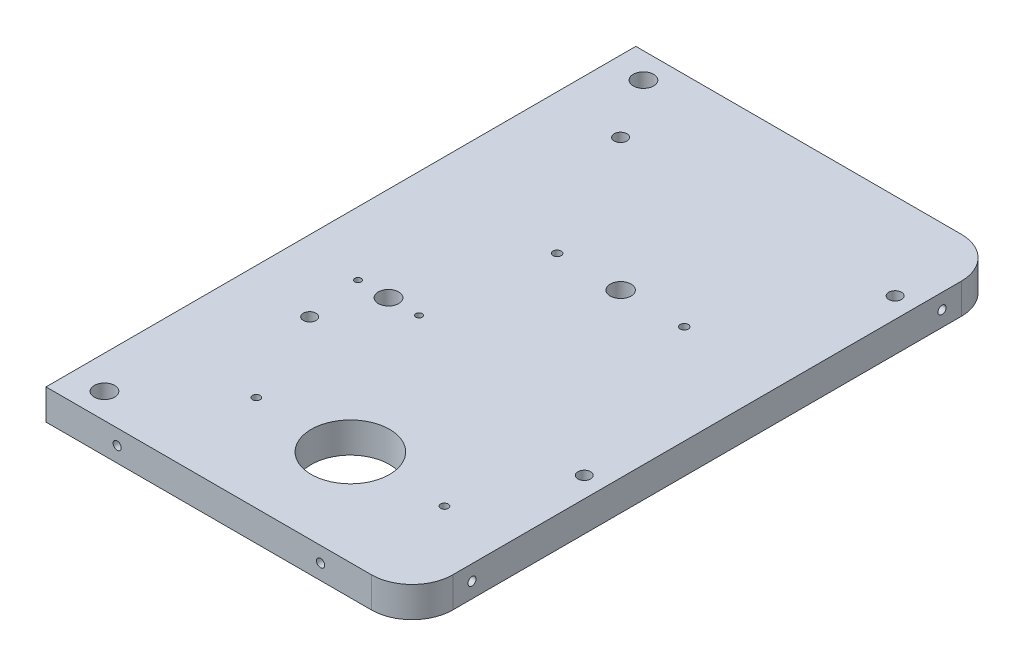
ISO-10303-21;
HEADER;
FILE_DESCRIPTION(('STEP AP214'),'2;1');
FILE_NAME('part.step','',(''),(''),'','','');
FILE_SCHEMA(('AUTOMOTIVE_DESIGN { 1 0 10303 214 1 1 1 1 }'));
ENDSEC;
DATA;
#1=APPLICATION_CONTEXT('core data for automotive mechanical design processes');
#2=APPLICATION_PROTOCOL_DEFINITION('international standard','automotive_design',2000,#1);
#3=PRODUCT_CONTEXT('',#1,'mechanical');
#4=PRODUCT('Part','Part','',(#3));
#5=PRODUCT_RELATED_PRODUCT_CATEGORY('part','',(#4));
#6=PRODUCT_DEFINITION_FORMATION('','',#4);
#7=PRODUCT_DEFINITION_CONTEXT('part definition',#1,'design');
#8=PRODUCT_DEFINITION('design','',#6,#7);
#9=PRODUCT_DEFINITION_SHAPE('','',#8);
#10=(LENGTH_UNIT() NAMED_UNIT(*) SI_UNIT(.MILLI.,.METRE.));
#11=(NAMED_UNIT(*) PLANE_ANGLE_UNIT() SI_UNIT($,.RADIAN.));
#12=(NAMED_UNIT(*) SI_UNIT($,.STERADIAN.) SOLID_ANGLE_UNIT());
#13=UNCERTAINTY_MEASURE_WITH_UNIT(LENGTH_MEASURE(1.E-05),#10,'distance_accuracy_value','');
#14=(GEOMETRIC_REPRESENTATION_CONTEXT(3) GLOBAL_UNCERTAINTY_ASSIGNED_CONTEXT((#13)) GLOBAL_UNIT_ASSIGNED_CONTEXT((#10,
#11,#12)) REPRESENTATION_CONTEXT('',''));
#15=CARTESIAN_POINT('',(0.,0.,0.));
#16=DIRECTION('',(0.,0.,1.));
#17=DIRECTION('',(1.,0.,0.));
#18=AXIS2_PLACEMENT_3D('',#15,#16,#17);
#19=CARTESIAN_POINT('',(0.,0.,0.));
#20=DIRECTION('',(0.,1.,0.));
#21=DIRECTION('',(0.,0.,1.));
#22=AXIS2_PLACEMENT_3D('',#19,#20,#21);
#23=PLANE('',#22);
#24=CARTESIAN_POINT('',(-0.981223813791759,0.,-18.0000330176937));
#25=DIRECTION('',(0.,-1.,0.));
#26=DIRECTION('',(0.,0.,-1.));
#27=AXIS2_PLACEMENT_3D('',#24,#25,#26);
#28=CIRCLE('',#27,2.05);
#29=CARTESIAN_POINT('',(-0.981223813791759,0.,-20.0500330176937));
#30=VERTEX_POINT('',#29);
#31=EDGE_CURVE('E192',#30,#30,#28,.T.);
#32=ORIENTED_EDGE('',*,*,#31,.F.);
#33=EDGE_LOOP('',(#32));
#34=FACE_BOUND('',#33,.T.);
#35=CARTESIAN_POINT('',(-0.981223813791759,0.,-18.0000330176937));
#36=DIRECTION('',(0.,-1.,0.));
#37=DIRECTION('',(0.,0.,-1.));
#38=AXIS2_PLACEMENT_3D('',#35,#36,#37);
#39=CIRCLE('',#38,2.55);
#40=CARTESIAN_POINT('',(-0.981223813791759,0.,-20.5500330176937));
#41=VERTEX_POINT('',#40);
#42=EDGE_CURVE('E195',#41,#41,#39,.T.);
#43=ORIENTED_EDGE('',*,*,#42,.T.);
#44=EDGE_LOOP('',(#43));
#45=FACE_BOUND('',#44,.T.);
#46=ADVANCED_FACE('F41',(#34,#45),#23,.F.);
#47=CARTESIAN_POINT('',(31.,3.,0.));
#48=DIRECTION('',(-1.,0.,0.));
#49=DIRECTION('',(0.,0.,1.));
#50=AXIS2_PLACEMENT_3D('',#47,#48,#49);
#51=PLANE('',#50);
#52=DIRECTION('',(0.,-1.,0.));
#53=VECTOR('',#52,1.);
#54=CARTESIAN_POINT('',(31.,7.,47.));
#55=LINE('',#54,#53);
#56=CARTESIAN_POINT('',(31.,3.,47.));
#57=VERTEX_POINT('',#56);
#58=CARTESIAN_POINT('',(31.,-3.,46.9999999999999));
#59=VERTEX_POINT('',#58);
#60=EDGE_CURVE('E134',#57,#59,#55,.T.);
#61=ORIENTED_EDGE('',*,*,#60,.T.);
#62=DIRECTION('',(0.,0.,1.));
#63=VECTOR('',#62,1.);
#64=CARTESIAN_POINT('',(31.,-3.,46.9999999999999));
#65=LINE('',#64,#63);
#66=CARTESIAN_POINT('',(31.,-3.,-53.));
#67=VERTEX_POINT('',#66);
#68=EDGE_CURVE('E128',#67,#59,#65,.T.);
#69=ORIENTED_EDGE('',*,*,#68,.F.);
#70=DIRECTION('',(0.,-1.,0.));
#71=VECTOR('',#70,1.);
#72=CARTESIAN_POINT('',(31.,7.,-53.));
#73=LINE('',#72,#71);
#74=CARTESIAN_POINT('',(31.,3.,-53.));
#75=VERTEX_POINT('',#74);
#76=EDGE_CURVE('E135',#75,#67,#73,.T.);
#77=ORIENTED_EDGE('',*,*,#76,.F.);
#78=DIRECTION('',(0.,0.,-1.));
#79=VECTOR('',#78,1.);
#80=CARTESIAN_POINT('',(31.,3.,0.));
#81=LINE('',#80,#79);
#82=EDGE_CURVE('E155',#57,#75,#81,.T.);
#83=ORIENTED_EDGE('',*,*,#82,.F.);
#84=EDGE_LOOP('',(#61,#69,#77,#83));
#85=FACE_BOUND('',#84,.T.);
#86=CARTESIAN_POINT('',(31.,0.,43.220009523448));
#87=DIRECTION('',(1.,0.,0.));
#88=DIRECTION('',(0.,0.,-1.));
#89=AXIS2_PLACEMENT_3D('',#86,#87,#88);
#90=CIRCLE('',#89,0.800000000000003);
#91=CARTESIAN_POINT('',(31.,0.,42.420009523448));
#92=VERTEX_POINT('',#91);
#93=EDGE_CURVE('E372',#92,#92,#90,.T.);
#94=ORIENTED_EDGE('',*,*,#93,.F.);
#95=EDGE_LOOP('',(#94));
#96=FACE_BOUND('',#95,.T.);
#97=CARTESIAN_POINT('',(31.,0.,-49.2200090857758));
#98=DIRECTION('',(1.,0.,0.));
#99=DIRECTION('',(0.,0.,-1.));
#100=AXIS2_PLACEMENT_3D('',#97,#98,#99);
#101=CIRCLE('',#100,0.800000000000003);
#102=CARTESIAN_POINT('',(31.,0.,-50.0200090857758));
#103=VERTEX_POINT('',#102);
#104=EDGE_CURVE('E381',#103,#103,#101,.T.);
#105=ORIENTED_EDGE('',*,*,#104,.F.);
#106=EDGE_LOOP('',(#105));
#107=FACE_BOUND('',#106,.T.);
#108=ADVANCED_FACE('F166',(#85,#96,#107),#51,.F.);
#109=CARTESIAN_POINT('',(31.,3.,-61.));
#110=DIRECTION('',(0.,0.,1.));
#111=DIRECTION('',(1.,0.,0.));
#112=AXIS2_PLACEMENT_3D('',#109,#110,#111);
#113=PLANE('',#112);
#114=DIRECTION('',(0.,-1.,0.));
#115=VECTOR('',#114,1.);
#116=CARTESIAN_POINT('',(23.,7.,-61.));
#117=LINE('',#116,#115);
#118=CARTESIAN_POINT('',(23.,-3.,-61.));
#119=VERTEX_POINT('',#118);
#120=CARTESIAN_POINT('',(23.,3.,-61.));
#121=VERTEX_POINT('',#120);
#122=EDGE_CURVE('E11',#119,#121,#117,.F.);
#123=ORIENTED_EDGE('',*,*,#122,.F.);
#124=DIRECTION('',(1.,0.,0.));
#125=VECTOR('',#124,1.);
#126=CARTESIAN_POINT('',(-41.,-3.,-61.));
#127=LINE('',#126,#125);
#128=CARTESIAN_POINT('',(-41.,-3.,-61.));
#129=VERTEX_POINT('',#128);
#130=EDGE_CURVE('E106',#129,#119,#127,.T.);
#131=ORIENTED_EDGE('',*,*,#130,.F.);
#132=DIRECTION('',(0.,-1.,0.));
#133=VECTOR('',#132,1.);
#134=CARTESIAN_POINT('',(-41.,3.,-61.));
#135=LINE('',#134,#133);
#136=CARTESIAN_POINT('',(-41.,3.,-61.));
#137=VERTEX_POINT('',#136);
#138=EDGE_CURVE('E94',#137,#129,#135,.T.);
#139=ORIENTED_EDGE('',*,*,#138,.F.);
#140=DIRECTION('',(-1.,0.,0.));
#141=VECTOR('',#140,1.);
#142=CARTESIAN_POINT('',(31.,3.,-61.));
#143=LINE('',#142,#141);
#144=EDGE_CURVE('E63',#121,#137,#143,.T.);
#145=ORIENTED_EDGE('',*,*,#144,.F.);
#146=EDGE_LOOP('',(#123,#131,#139,#145));
#147=FACE_BOUND('',#146,.T.);
#148=CARTESIAN_POINT('',(12.9999999999997,0.,-61.));
#149=DIRECTION('',(0.,0.,-1.));
#150=DIRECTION('',(-1.,0.,0.));
#151=AXIS2_PLACEMENT_3D('',#148,#149,#150);
#152=CIRCLE('',#151,0.800000000000001);
#153=CARTESIAN_POINT('',(12.1999999999997,0.,-61.));
#154=VERTEX_POINT('',#153);
#155=EDGE_CURVE('E267',#154,#154,#152,.T.);
#156=ORIENTED_EDGE('',*,*,#155,.F.);
#157=EDGE_LOOP('',(#156));
#158=FACE_BOUND('',#157,.T.);
#159=CARTESIAN_POINT('',(-27.0000000000002,0.,-61.));
#160=DIRECTION('',(0.,0.,-1.));
#161=DIRECTION('',(-1.,0.,0.));
#162=AXIS2_PLACEMENT_3D('',#159,#160,#161);
#163=CIRCLE('',#162,0.799999999999999);
#164=CARTESIAN_POINT('',(-27.8000000000002,0.,-61.));
#165=VERTEX_POINT('',#164);
#166=EDGE_CURVE('E371',#165,#165,#163,.T.);
#167=ORIENTED_EDGE('',*,*,#166,.F.);
#168=EDGE_LOOP('',(#167));
#169=FACE_BOUND('',#168,.T.);
#170=ADVANCED_FACE('F107',(#147,#158,#169),#113,.F.);
#171=CARTESIAN_POINT('',(0.,3.,0.));
#172=DIRECTION('',(0.,1.,0.));
#173=DIRECTION('',(0.,0.,1.));
#174=AXIS2_PLACEMENT_3D('',#171,#172,#173);
#175=PLANE('',#174);
#176=CARTESIAN_POINT('',(-13.4812238138933,3.,-18.0000330178182));
#177=DIRECTION('',(0.,-1.,0.));
#178=DIRECTION('',(0.,0.,-1.));
#179=AXIS2_PLACEMENT_3D('',#176,#177,#178);
#180=CIRCLE('',#179,0.800000000000001);
#181=CARTESIAN_POINT('',(-13.4812238138933,3.,-18.8000330178182));
#182=VERTEX_POINT('',#181);
#183=EDGE_CURVE('E738',#182,#182,#180,.T.);
#184=ORIENTED_EDGE('',*,*,#183,.T.);
#185=EDGE_LOOP('',(#184));
#186=FACE_BOUND('',#185,.T.);
#187=CARTESIAN_POINT('',(11.5187761861068,3.,-18.0000330178182));
#188=DIRECTION('',(0.,-1.,0.));
#189=DIRECTION('',(0.,0.,-1.));
#190=AXIS2_PLACEMENT_3D('',#187,#188,#189);
#191=CIRCLE('',#190,0.800000000000003);
#192=CARTESIAN_POINT('',(11.5187761861068,3.,-18.8000330178182));
#193=VERTEX_POINT('',#192);
#194=EDGE_CURVE('E742',#193,#193,#191,.T.);
#195=ORIENTED_EDGE('',*,*,#194,.T.);
#196=EDGE_LOOP('',(#195));
#197=FACE_BOUND('',#196,.T.);
#198=CARTESIAN_POINT('',(-0.981223813791759,3.,-18.0000330176937));
#199=DIRECTION('',(0.,-1.,0.));
#200=DIRECTION('',(0.,0.,-1.));
#201=AXIS2_PLACEMENT_3D('',#198,#199,#200);
#202=CIRCLE('',#201,2.05);
#203=CARTESIAN_POINT('',(-0.981223813791759,3.,-20.0500330176937));
#204=VERTEX_POINT('',#203);
#205=EDGE_CURVE('E204',#204,#204,#202,.T.);
#206=ORIENTED_EDGE('',*,*,#205,.T.);
#207=EDGE_LOOP('',(#206));
#208=FACE_BOUND('',#207,.T.);
#209=CARTESIAN_POINT('',(-22.5019779725675,3.,6.1394144977128));
#210=DIRECTION('',(0.,-1.,0.));
#211=DIRECTION('',(0.,0.,-1.));
#212=AXIS2_PLACEMENT_3D('',#209,#210,#211);
#213=CIRCLE('',#212,1.99999999989408);
#214=CARTESIAN_POINT('',(-22.5019779725675,3.,4.13941449781872));
#215=VERTEX_POINT('',#214);
#216=EDGE_CURVE('E201',#215,#215,#213,.T.);
#217=ORIENTED_EDGE('',*,*,#216,.T.);
#218=EDGE_LOOP('',(#217));
#219=FACE_BOUND('',#218,.T.);
#220=CARTESIAN_POINT('',(23.,3.,-53.));
#221=DIRECTION('',(0.,1.,0.));
#222=DIRECTION('',(0.,0.,1.));
#223=AXIS2_PLACEMENT_3D('',#220,#221,#222);
#224=CIRCLE('',#223,8.);
#225=EDGE_CURVE('E139',#121,#75,#224,.F.);
#226=ORIENTED_EDGE('',*,*,#225,.F.);
#227=ORIENTED_EDGE('',*,*,#144,.T.);
#228=DIRECTION('',(0.,0.,-1.));
#229=VECTOR('',#228,1.);
#230=CARTESIAN_POINT('',(-41.,3.,55.));
#231=LINE('',#230,#229);
#232=CARTESIAN_POINT('',(-41.,3.,55.));
#233=VERTEX_POINT('',#232);
#234=EDGE_CURVE('E100',#233,#137,#231,.T.);
#235=ORIENTED_EDGE('',*,*,#234,.F.);
#236=DIRECTION('',(1.,0.,0.));
#237=VECTOR('',#236,1.);
#238=CARTESIAN_POINT('',(-31.,3.,55.));
#239=LINE('',#238,#237);
#240=CARTESIAN_POINT('',(23.,3.,55.));
#241=VERTEX_POINT('',#240);
#242=EDGE_CURVE('E102',#233,#241,#239,.T.);
#243=ORIENTED_EDGE('',*,*,#242,.T.);
#244=CARTESIAN_POINT('',(23.,3.,47.));
#245=DIRECTION('',(0.,1.,0.));
#246=DIRECTION('',(0.,0.,1.));
#247=AXIS2_PLACEMENT_3D('',#244,#245,#246);
#248=CIRCLE('',#247,8.);
#249=EDGE_CURVE('E55',#57,#241,#248,.F.);
#250=ORIENTED_EDGE('',*,*,#249,.F.);
#251=ORIENTED_EDGE('',*,*,#82,.T.);
#252=EDGE_LOOP('',(#226,#227,#235,#243,#250,#251));
#253=FACE_BOUND('',#252,.T.);
#254=CARTESIAN_POINT('',(-34.5,3.,50.));
#255=DIRECTION('',(0.,1.,0.));
#256=DIRECTION('',(0.,0.,1.));
#257=AXIS2_PLACEMENT_3D('',#254,#255,#256);
#258=CIRCLE('',#257,2.);
#259=CARTESIAN_POINT('',(-34.5,3.,52.));
#260=VERTEX_POINT('',#259);
#261=EDGE_CURVE('E144',#260,#260,#258,.T.);
#262=ORIENTED_EDGE('',*,*,#261,.F.);
#263=EDGE_LOOP('',(#262));
#264=FACE_BOUND('',#263,.T.);
#265=CARTESIAN_POINT('',(-34.5,3.,-56.));
#266=DIRECTION('',(0.,1.,0.));
#267=DIRECTION('',(0.,0.,1.));
#268=AXIS2_PLACEMENT_3D('',#265,#266,#267);
#269=CIRCLE('',#268,2.);
#270=CARTESIAN_POINT('',(-34.5,3.,-54.));
#271=VERTEX_POINT('',#270);
#272=EDGE_CURVE('E141',#271,#271,#269,.T.);
#273=ORIENTED_EDGE('',*,*,#272,.F.);
#274=EDGE_LOOP('',(#273));
#275=FACE_BOUND('',#274,.T.);
#276=CARTESIAN_POINT('',(0.,3.,36.1397530310026));
#277=DIRECTION('',(0.,-1.,0.));
#278=DIRECTION('',(0.,0.,-1.));
#279=AXIS2_PLACEMENT_3D('',#276,#277,#278);
#280=CIRCLE('',#279,7.7);
#281=CARTESIAN_POINT('',(0.,3.,28.4397530310026));
#282=VERTEX_POINT('',#281);
#283=EDGE_CURVE('E151',#282,#282,#280,.T.);
#284=ORIENTED_EDGE('',*,*,#283,.T.);
#285=EDGE_LOOP('',(#284));
#286=FACE_BOUND('',#285,.T.);
#287=CARTESIAN_POINT('',(27.,3.,17.1397530310026));
#288=DIRECTION('',(0.,-1.,0.));
#289=DIRECTION('',(0.,0.,-1.));
#290=AXIS2_PLACEMENT_3D('',#287,#288,#289);
#291=CIRCLE('',#290,1.25);
#292=CARTESIAN_POINT('',(27.,3.,15.8897530310026));
#293=VERTEX_POINT('',#292);
#294=EDGE_CURVE('E295',#293,#293,#291,.T.);
#295=ORIENTED_EDGE('',*,*,#294,.T.);
#296=EDGE_LOOP('',(#295));
#297=FACE_BOUND('',#296,.T.);
#298=CARTESIAN_POINT('',(27.,3.,-44.));
#299=DIRECTION('',(0.,-1.,0.));
#300=DIRECTION('',(0.,0.,-1.));
#301=AXIS2_PLACEMENT_3D('',#298,#299,#300);
#302=CIRCLE('',#301,1.25);
#303=CARTESIAN_POINT('',(27.,3.,-45.25));
#304=VERTEX_POINT('',#303);
#305=EDGE_CURVE('E291',#304,#304,#302,.T.);
#306=ORIENTED_EDGE('',*,*,#305,.T.);
#307=EDGE_LOOP('',(#306));
#308=FACE_BOUND('',#307,.T.);
#309=CARTESIAN_POINT('',(-27.,3.,17.1397530310026));
#310=DIRECTION('',(0.,-1.,0.));
#311=DIRECTION('',(0.,0.,-1.));
#312=AXIS2_PLACEMENT_3D('',#309,#310,#311);
#313=CIRCLE('',#312,1.25);
#314=CARTESIAN_POINT('',(-27.,3.,15.8897530310026));
#315=VERTEX_POINT('',#314);
#316=EDGE_CURVE('E287',#315,#315,#313,.T.);
#317=ORIENTED_EDGE('',*,*,#316,.T.);
#318=EDGE_LOOP('',(#317));
#319=FACE_BOUND('',#318,.T.);
#320=CARTESIAN_POINT('',(18.5,3.,36.1397772027098));
#321=DIRECTION('',(0.,-1.,0.));
#322=DIRECTION('',(0.,0.,-1.));
#323=AXIS2_PLACEMENT_3D('',#320,#321,#322);
#324=CIRCLE('',#323,0.750000000000002);
#325=CARTESIAN_POINT('',(18.5,3.,35.3897772027098));
#326=VERTEX_POINT('',#325);
#327=EDGE_CURVE('E283',#326,#326,#324,.T.);
#328=ORIENTED_EDGE('',*,*,#327,.T.);
#329=EDGE_LOOP('',(#328));
#330=FACE_BOUND('',#329,.T.);
#331=CARTESIAN_POINT('',(-27.,3.,-44.));
#332=DIRECTION('',(0.,-1.,0.));
#333=DIRECTION('',(0.,0.,1.));
#334=AXIS2_PLACEMENT_3D('',#331,#332,#333);
#335=CIRCLE('',#334,1.25000000000003);
#336=CARTESIAN_POINT('',(-27.,3.,-42.75));
#337=VERTEX_POINT('',#336);
#338=EDGE_CURVE('E279',#337,#337,#335,.T.);
#339=ORIENTED_EDGE('',*,*,#338,.T.);
#340=EDGE_LOOP('',(#339));
#341=FACE_BOUND('',#340,.T.);
#342=CARTESIAN_POINT('',(-18.5,3.,36.1397772027098));
#343=DIRECTION('',(0.,-1.,0.));
#344=DIRECTION('',(0.,0.,1.));
#345=AXIS2_PLACEMENT_3D('',#342,#343,#344);
#346=CIRCLE('',#345,0.750000000000002);
#347=CARTESIAN_POINT('',(-18.5,3.,36.8897772027098));
#348=VERTEX_POINT('',#347);
#349=EDGE_CURVE('E275',#348,#348,#346,.T.);
#350=ORIENTED_EDGE('',*,*,#349,.T.);
#351=EDGE_LOOP('',(#350));
#352=FACE_BOUND('',#351,.T.);
#353=CARTESIAN_POINT('',(-16.5015460168153,3.,6.1397530310026));
#354=DIRECTION('',(0.,-1.,0.));
#355=DIRECTION('',(0.,0.,-1.));
#356=AXIS2_PLACEMENT_3D('',#353,#354,#355);
#357=CIRCLE('',#356,0.625000000000002);
#358=CARTESIAN_POINT('',(-16.5015460168153,3.,5.5147530310026));
#359=VERTEX_POINT('',#358);
#360=EDGE_CURVE('E271',#359,#359,#357,.T.);
#361=ORIENTED_EDGE('',*,*,#360,.T.);
#362=EDGE_LOOP('',(#361));
#363=FACE_BOUND('',#362,.T.);
#364=CARTESIAN_POINT('',(-28.5024099283197,3.,6.1397530310026));
#365=DIRECTION('',(0.,-1.,0.));
#366=DIRECTION('',(0.,0.,1.));
#367=AXIS2_PLACEMENT_3D('',#364,#365,#366);
#368=CIRCLE('',#367,0.625000000000002);
#369=CARTESIAN_POINT('',(-28.5024099283197,3.,6.76475303100261));
#370=VERTEX_POINT('',#369);
#371=EDGE_CURVE('E261',#370,#370,#368,.T.);
#372=ORIENTED_EDGE('',*,*,#371,.T.);
#373=EDGE_LOOP('',(#372));
#374=FACE_BOUND('',#373,.T.);
#375=ADVANCED_FACE('F161',(#186,#197,#208,#219,#253,#264,#275,#286,#297,#308,#319,#330,#341,
#352,#363,#374),#175,.T.);
#376=CARTESIAN_POINT('',(0.,3.,36.1397530310026));
#377=DIRECTION('',(0.,-1.,0.));
#378=DIRECTION('',(0.,0.,-1.));
#379=AXIS2_PLACEMENT_3D('',#376,#377,#378);
#380=CYLINDRICAL_SURFACE('',#379,7.7);
#381=ORIENTED_EDGE('',*,*,#283,.F.);
#382=EDGE_LOOP('',(#381));
#383=FACE_BOUND('',#382,.T.);
#384=CARTESIAN_POINT('',(0.,-3.,36.1397530310026));
#385=DIRECTION('',(0.,-1.,0.));
#386=DIRECTION('',(0.,0.,-1.));
#387=AXIS2_PLACEMENT_3D('',#384,#385,#386);
#388=CIRCLE('',#387,7.7);
#389=CARTESIAN_POINT('',(0.,-3.,28.4397530310026));
#390=VERTEX_POINT('',#389);
#391=EDGE_CURVE('E120',#390,#390,#388,.T.);
#392=ORIENTED_EDGE('',*,*,#391,.T.);
#393=EDGE_LOOP('',(#392));
#394=FACE_BOUND('',#393,.T.);
#395=ADVANCED_FACE('F435',(#383,#394),#380,.F.);
#396=CARTESIAN_POINT('',(-31.,3.,55.));
#397=DIRECTION('',(0.,0.,-1.));
#398=DIRECTION('',(-1.,0.,0.));
#399=AXIS2_PLACEMENT_3D('',#396,#397,#398);
#400=PLANE('',#399);
#401=DIRECTION('',(0.,-1.,0.));
#402=VECTOR('',#401,1.);
#403=CARTESIAN_POINT('',(-41.,3.,55.));
#404=LINE('',#403,#402);
#405=CARTESIAN_POINT('',(-41.,-3.,55.));
#406=VERTEX_POINT('',#405);
#407=EDGE_CURVE('E103',#233,#406,#404,.T.);
#408=ORIENTED_EDGE('',*,*,#407,.T.);
#409=DIRECTION('',(-1.,0.,0.));
#410=VECTOR('',#409,1.);
#411=CARTESIAN_POINT('',(-41.,-3.,55.));
#412=LINE('',#411,#410);
#413=CARTESIAN_POINT('',(22.9999999999999,-3.,55.));
#414=VERTEX_POINT('',#413);
#415=EDGE_CURVE('E119',#414,#406,#412,.T.);
#416=ORIENTED_EDGE('',*,*,#415,.F.);
#417=DIRECTION('',(0.,-1.,0.));
#418=VECTOR('',#417,1.);
#419=CARTESIAN_POINT('',(23.,7.,55.));
#420=LINE('',#419,#418);
#421=EDGE_CURVE('E48',#414,#241,#420,.F.);
#422=ORIENTED_EDGE('',*,*,#421,.T.);
#423=ORIENTED_EDGE('',*,*,#242,.F.);
#424=EDGE_LOOP('',(#408,#416,#422,#423));
#425=FACE_BOUND('',#424,.T.);
#426=CARTESIAN_POINT('',(-27.0000000000002,0.,55.));
#427=DIRECTION('',(0.,0.,1.));
#428=DIRECTION('',(1.,0.,0.));
#429=AXIS2_PLACEMENT_3D('',#426,#427,#428);
#430=CIRCLE('',#429,0.799999999999999);
#431=CARTESIAN_POINT('',(-26.2000000000002,0.,55.));
#432=VERTEX_POINT('',#431);
#433=EDGE_CURVE('E755',#432,#432,#430,.T.);
#434=ORIENTED_EDGE('',*,*,#433,.F.);
#435=EDGE_LOOP('',(#434));
#436=FACE_BOUND('',#435,.T.);
#437=CARTESIAN_POINT('',(12.9999999999997,0.,55.));
#438=DIRECTION('',(0.,0.,1.));
#439=DIRECTION('',(1.,0.,0.));
#440=AXIS2_PLACEMENT_3D('',#437,#438,#439);
#441=CIRCLE('',#440,0.800000000000001);
#442=CARTESIAN_POINT('',(13.7999999999997,0.,55.));
#443=VERTEX_POINT('',#442);
#444=EDGE_CURVE('E744',#443,#443,#441,.T.);
#445=ORIENTED_EDGE('',*,*,#444,.F.);
#446=EDGE_LOOP('',(#445));
#447=FACE_BOUND('',#446,.T.);
#448=ADVANCED_FACE('F158',(#425,#436,#447),#400,.F.);
#449=CARTESIAN_POINT('',(-41.,3.,55.));
#450=DIRECTION('',(-1.,0.,0.));
#451=DIRECTION('',(0.,0.,1.));
#452=AXIS2_PLACEMENT_3D('',#449,#450,#451);
#453=PLANE('',#452);
#454=ORIENTED_EDGE('',*,*,#138,.T.);
#455=DIRECTION('',(0.,0.,-1.));
#456=VECTOR('',#455,1.);
#457=CARTESIAN_POINT('',(-41.,-3.,55.));
#458=LINE('',#457,#456);
#459=EDGE_CURVE('E99',#406,#129,#458,.T.);
#460=ORIENTED_EDGE('',*,*,#459,.F.);
#461=ORIENTED_EDGE('',*,*,#407,.F.);
#462=ORIENTED_EDGE('',*,*,#234,.T.);
#463=EDGE_LOOP('',(#454,#460,#461,#462));
#464=FACE_BOUND('',#463,.T.);
#465=ADVANCED_FACE('F96',(#464),#453,.T.);
#466=CARTESIAN_POINT('',(-34.5,10.,-56.));
#467=DIRECTION('',(0.,-1.,0.));
#468=DIRECTION('',(0.,0.,-1.));
#469=AXIS2_PLACEMENT_3D('',#466,#467,#468);
#470=CYLINDRICAL_SURFACE('',#469,2.);
#471=ORIENTED_EDGE('',*,*,#272,.T.);
#472=EDGE_LOOP('',(#471));
#473=FACE_BOUND('',#472,.T.);
#474=CARTESIAN_POINT('',(-34.5,-3.,-56.));
#475=DIRECTION('',(0.,-1.,0.));
#476=DIRECTION('',(0.,0.,-1.));
#477=AXIS2_PLACEMENT_3D('',#474,#475,#476);
#478=CIRCLE('',#477,2.);
#479=CARTESIAN_POINT('',(-34.5,-3.,-58.));
#480=VERTEX_POINT('',#479);
#481=EDGE_CURVE('E123',#480,#480,#478,.T.);
#482=ORIENTED_EDGE('',*,*,#481,.T.);
#483=EDGE_LOOP('',(#482));
#484=FACE_BOUND('',#483,.T.);
#485=ADVANCED_FACE('F180',(#473,#484),#470,.F.);
#486=CARTESIAN_POINT('',(-34.5,10.,50.));
#487=DIRECTION('',(0.,-1.,0.));
#488=DIRECTION('',(0.,0.,-1.));
#489=AXIS2_PLACEMENT_3D('',#486,#487,#488);
#490=CYLINDRICAL_SURFACE('',#489,2.);
#491=ORIENTED_EDGE('',*,*,#261,.T.);
#492=EDGE_LOOP('',(#491));
#493=FACE_BOUND('',#492,.T.);
#494=CARTESIAN_POINT('',(-34.5,-3.,50.));
#495=DIRECTION('',(0.,-1.,0.));
#496=DIRECTION('',(0.,0.,-1.));
#497=AXIS2_PLACEMENT_3D('',#494,#495,#496);
#498=CIRCLE('',#497,2.);
#499=CARTESIAN_POINT('',(-34.5,-3.,48.));
#500=VERTEX_POINT('',#499);
#501=EDGE_CURVE('E215',#500,#500,#498,.T.);
#502=ORIENTED_EDGE('',*,*,#501,.T.);
#503=EDGE_LOOP('',(#502));
#504=FACE_BOUND('',#503,.T.);
#505=ADVANCED_FACE('F173',(#493,#504),#490,.F.);
#506=CARTESIAN_POINT('',(23.,7.,47.));
#507=DIRECTION('',(0.,-1.,0.));
#508=DIRECTION('',(0.,0.,-1.));
#509=AXIS2_PLACEMENT_3D('',#506,#507,#508);
#510=CYLINDRICAL_SURFACE('',#509,8.);
#511=ORIENTED_EDGE('',*,*,#249,.T.);
#512=ORIENTED_EDGE('',*,*,#421,.F.);
#513=CARTESIAN_POINT('',(23.,-3.,47.));
#514=DIRECTION('',(0.,-1.,0.));
#515=DIRECTION('',(0.,0.,1.));
#516=AXIS2_PLACEMENT_3D('',#513,#514,#515);
#517=CIRCLE('',#516,8.);
#518=EDGE_CURVE('E131',#59,#414,#517,.T.);
#519=ORIENTED_EDGE('',*,*,#518,.F.);
#520=ORIENTED_EDGE('',*,*,#60,.F.);
#521=EDGE_LOOP('',(#511,#512,#519,#520));
#522=FACE_BOUND('',#521,.T.);
#523=ADVANCED_FACE('F171',(#522),#510,.T.);
#524=CARTESIAN_POINT('',(23.,7.,-53.));
#525=DIRECTION('',(0.,-1.,0.));
#526=DIRECTION('',(0.,0.,-1.));
#527=AXIS2_PLACEMENT_3D('',#524,#525,#526);
#528=CYLINDRICAL_SURFACE('',#527,8.);
#529=ORIENTED_EDGE('',*,*,#225,.T.);
#530=ORIENTED_EDGE('',*,*,#76,.T.);
#531=CARTESIAN_POINT('',(23.,-3.,-53.));
#532=DIRECTION('',(0.,-1.,0.));
#533=DIRECTION('',(0.,0.,-1.));
#534=AXIS2_PLACEMENT_3D('',#531,#532,#533);
#535=CIRCLE('',#534,8.);
#536=EDGE_CURVE('E112',#119,#67,#535,.T.);
#537=ORIENTED_EDGE('',*,*,#536,.F.);
#538=ORIENTED_EDGE('',*,*,#122,.T.);
#539=EDGE_LOOP('',(#529,#530,#537,#538));
#540=FACE_BOUND('',#539,.T.);
#541=ADVANCED_FACE('F170',(#540),#528,.T.);
#542=CARTESIAN_POINT('',(23.,-3.,-53.));
#543=DIRECTION('',(0.,-1.,0.));
#544=DIRECTION('',(0.,0.,-1.));
#545=AXIS2_PLACEMENT_3D('',#542,#543,#544);
#546=PLANE('',#545);
#547=CARTESIAN_POINT('',(-13.4812238138933,-3.,-18.0000330178182));
#548=DIRECTION('',(0.,-1.,0.));
#549=DIRECTION('',(0.,0.,-1.));
#550=AXIS2_PLACEMENT_3D('',#547,#548,#549);
#551=CIRCLE('',#550,0.800000000000001);
#552=CARTESIAN_POINT('',(-13.4812238138933,-3.,-18.8000330178182));
#553=VERTEX_POINT('',#552);
#554=EDGE_CURVE('E741',#553,#553,#551,.T.);
#555=ORIENTED_EDGE('',*,*,#554,.F.);
#556=EDGE_LOOP('',(#555));
#557=FACE_BOUND('',#556,.T.);
#558=CARTESIAN_POINT('',(11.5187761861068,-3.,-18.0000330178182));
#559=DIRECTION('',(0.,-1.,0.));
#560=DIRECTION('',(0.,0.,-1.));
#561=AXIS2_PLACEMENT_3D('',#558,#559,#560);
#562=CIRCLE('',#561,0.800000000000003);
#563=CARTESIAN_POINT('',(11.5187761861068,-3.,-18.8000330178182));
#564=VERTEX_POINT('',#563);
#565=EDGE_CURVE('E747',#564,#564,#562,.T.);
#566=ORIENTED_EDGE('',*,*,#565,.F.);
#567=EDGE_LOOP('',(#566));
#568=FACE_BOUND('',#567,.T.);
#569=CARTESIAN_POINT('',(-22.5019779725675,-3.,6.1394144977128));
#570=DIRECTION('',(0.,-1.,0.));
#571=DIRECTION('',(0.,0.,-1.));
#572=AXIS2_PLACEMENT_3D('',#569,#570,#571);
#573=CIRCLE('',#572,2.99999999989408);
#574=CARTESIAN_POINT('',(-22.5019779725675,-3.,3.13941449781872));
#575=VERTEX_POINT('',#574);
#576=EDGE_CURVE('E210',#575,#575,#573,.T.);
#577=ORIENTED_EDGE('',*,*,#576,.F.);
#578=EDGE_LOOP('',(#577));
#579=FACE_BOUND('',#578,.T.);
#580=ORIENTED_EDGE('',*,*,#501,.F.);
#581=EDGE_LOOP('',(#580));
#582=FACE_BOUND('',#581,.T.);
#583=ORIENTED_EDGE('',*,*,#391,.F.);
#584=EDGE_LOOP('',(#583));
#585=FACE_BOUND('',#584,.T.);
#586=ORIENTED_EDGE('',*,*,#459,.T.);
#587=ORIENTED_EDGE('',*,*,#130,.T.);
#588=ORIENTED_EDGE('',*,*,#536,.T.);
#589=ORIENTED_EDGE('',*,*,#68,.T.);
#590=ORIENTED_EDGE('',*,*,#518,.T.);
#591=ORIENTED_EDGE('',*,*,#415,.T.);
#592=EDGE_LOOP('',(#586,#587,#588,#589,#590,#591));
#593=FACE_BOUND('',#592,.T.);
#594=ORIENTED_EDGE('',*,*,#481,.F.);
#595=EDGE_LOOP('',(#594));
#596=FACE_BOUND('',#595,.T.);
#597=CARTESIAN_POINT('',(-0.981223813791759,-3.,-18.0000330176937));
#598=DIRECTION('',(0.,-1.,0.));
#599=DIRECTION('',(0.,0.,-1.));
#600=AXIS2_PLACEMENT_3D('',#597,#598,#599);
#601=CIRCLE('',#600,2.55);
#602=CARTESIAN_POINT('',(-0.981223813791759,-3.,-20.5500330176937));
#603=VERTEX_POINT('',#602);
#604=EDGE_CURVE('E198',#603,#603,#601,.T.);
#605=ORIENTED_EDGE('',*,*,#604,.F.);
#606=EDGE_LOOP('',(#605));
#607=FACE_BOUND('',#606,.T.);
#608=CARTESIAN_POINT('',(27.,-3.,17.1397530310026));
#609=DIRECTION('',(0.,-1.,0.));
#610=DIRECTION('',(0.,0.,-1.));
#611=AXIS2_PLACEMENT_3D('',#608,#609,#610);
#612=CIRCLE('',#611,1.25);
#613=CARTESIAN_POINT('',(27.,-3.,15.8897530310026));
#614=VERTEX_POINT('',#613);
#615=EDGE_CURVE('E232',#614,#614,#612,.T.);
#616=ORIENTED_EDGE('',*,*,#615,.F.);
#617=EDGE_LOOP('',(#616));
#618=FACE_BOUND('',#617,.T.);
#619=CARTESIAN_POINT('',(27.,-3.,-44.));
#620=DIRECTION('',(0.,-1.,0.));
#621=DIRECTION('',(0.,0.,-1.));
#622=AXIS2_PLACEMENT_3D('',#619,#620,#621);
#623=CIRCLE('',#622,1.25);
#624=CARTESIAN_POINT('',(27.,-3.,-45.25));
#625=VERTEX_POINT('',#624);
#626=EDGE_CURVE('E236',#625,#625,#623,.T.);
#627=ORIENTED_EDGE('',*,*,#626,.F.);
#628=EDGE_LOOP('',(#627));
#629=FACE_BOUND('',#628,.T.);
#630=CARTESIAN_POINT('',(-27.,-3.,17.1397530310026));
#631=DIRECTION('',(0.,-1.,0.));
#632=DIRECTION('',(0.,0.,-1.));
#633=AXIS2_PLACEMENT_3D('',#630,#631,#632);
#634=CIRCLE('',#633,1.25);
#635=CARTESIAN_POINT('',(-27.,-3.,15.8897530310026));
#636=VERTEX_POINT('',#635);
#637=EDGE_CURVE('E240',#636,#636,#634,.T.);
#638=ORIENTED_EDGE('',*,*,#637,.F.);
#639=EDGE_LOOP('',(#638));
#640=FACE_BOUND('',#639,.T.);
#641=CARTESIAN_POINT('',(18.5,-3.,36.1397772027098));
#642=DIRECTION('',(0.,-1.,0.));
#643=DIRECTION('',(0.,0.,-1.));
#644=AXIS2_PLACEMENT_3D('',#641,#642,#643);
#645=CIRCLE('',#644,0.750000000000002);
#646=CARTESIAN_POINT('',(18.5,-3.,35.3897772027098));
#647=VERTEX_POINT('',#646);
#648=EDGE_CURVE('E244',#647,#647,#645,.T.);
#649=ORIENTED_EDGE('',*,*,#648,.F.);
#650=EDGE_LOOP('',(#649));
#651=FACE_BOUND('',#650,.T.);
#652=CARTESIAN_POINT('',(-27.,-3.,-44.));
#653=DIRECTION('',(0.,-1.,0.));
#654=DIRECTION('',(0.,0.,1.));
#655=AXIS2_PLACEMENT_3D('',#652,#653,#654);
#656=CIRCLE('',#655,1.25000000000003);
#657=CARTESIAN_POINT('',(-27.,-3.,-42.75));
#658=VERTEX_POINT('',#657);
#659=EDGE_CURVE('E248',#658,#658,#656,.T.);
#660=ORIENTED_EDGE('',*,*,#659,.F.);
#661=EDGE_LOOP('',(#660));
#662=FACE_BOUND('',#661,.T.);
#663=CARTESIAN_POINT('',(-18.5,-3.,36.1397772027098));
#664=DIRECTION('',(0.,-1.,0.));
#665=DIRECTION('',(0.,0.,1.));
#666=AXIS2_PLACEMENT_3D('',#663,#664,#665);
#667=CIRCLE('',#666,0.750000000000002);
#668=CARTESIAN_POINT('',(-18.5,-3.,36.8897772027098));
#669=VERTEX_POINT('',#668);
#670=EDGE_CURVE('E252',#669,#669,#667,.T.);
#671=ORIENTED_EDGE('',*,*,#670,.F.);
#672=EDGE_LOOP('',(#671));
#673=FACE_BOUND('',#672,.T.);
#674=CARTESIAN_POINT('',(-16.5015460168153,-3.,6.1397530310026));
#675=DIRECTION('',(0.,-1.,0.));
#676=DIRECTION('',(0.,0.,-1.));
#677=AXIS2_PLACEMENT_3D('',#674,#675,#676);
#678=CIRCLE('',#677,0.625000000000002);
#679=CARTESIAN_POINT('',(-16.5015460168153,-3.,5.5147530310026));
#680=VERTEX_POINT('',#679);
#681=EDGE_CURVE('E256',#680,#680,#678,.T.);
#682=ORIENTED_EDGE('',*,*,#681,.F.);
#683=EDGE_LOOP('',(#682));
#684=FACE_BOUND('',#683,.T.);
#685=CARTESIAN_POINT('',(-28.5024099283197,-3.,6.1397530310026));
#686=DIRECTION('',(0.,-1.,0.));
#687=DIRECTION('',(0.,0.,1.));
#688=AXIS2_PLACEMENT_3D('',#685,#686,#687);
#689=CIRCLE('',#688,0.625000000000002);
#690=CARTESIAN_POINT('',(-28.5024099283197,-3.,6.76475303100261));
#691=VERTEX_POINT('',#690);
#692=EDGE_CURVE('E259',#691,#691,#689,.T.);
#693=ORIENTED_EDGE('',*,*,#692,.F.);
#694=EDGE_LOOP('',(#693));
#695=FACE_BOUND('',#694,.T.);
#696=ADVANCED_FACE('F115',(#557,#568,#579,#582,#585,#593,#596,#607,#618,#629,#640,#651,#662,
#673,#684,#695),#546,.T.);
#697=CARTESIAN_POINT('',(-22.5019779725675,0.,6.1394144977128));
#698=DIRECTION('',(0.,-1.,0.));
#699=DIRECTION('',(0.,0.,-1.));
#700=AXIS2_PLACEMENT_3D('',#697,#698,#699);
#701=PLANE('',#700);
#702=CARTESIAN_POINT('',(-22.5019779725675,0.,6.1394144977128));
#703=DIRECTION('',(0.,-1.,0.));
#704=DIRECTION('',(0.,0.,-1.));
#705=AXIS2_PLACEMENT_3D('',#702,#703,#704);
#706=CIRCLE('',#705,1.99999999989408);
#707=CARTESIAN_POINT('',(-22.5019779725675,0.,4.13941449781872));
#708=VERTEX_POINT('',#707);
#709=EDGE_CURVE('E197',#708,#708,#706,.T.);
#710=ORIENTED_EDGE('',*,*,#709,.F.);
#711=EDGE_LOOP('',(#710));
#712=FACE_BOUND('',#711,.T.);
#713=CARTESIAN_POINT('',(-22.5019779725675,0.,6.1394144977128));
#714=DIRECTION('',(0.,-1.,0.));
#715=DIRECTION('',(0.,0.,-1.));
#716=AXIS2_PLACEMENT_3D('',#713,#714,#715);
#717=CIRCLE('',#716,2.99999999989408);
#718=CARTESIAN_POINT('',(-22.5019779725675,0.,3.13941449781872));
#719=VERTEX_POINT('',#718);
#720=EDGE_CURVE('E212',#719,#719,#717,.T.);
#721=ORIENTED_EDGE('',*,*,#720,.T.);
#722=EDGE_LOOP('',(#721));
#723=FACE_BOUND('',#722,.T.);
#724=ADVANCED_FACE('F224',(#712,#723),#701,.T.);
#725=CARTESIAN_POINT('',(-22.5019779725675,0.,6.1394144977128));
#726=DIRECTION('',(0.,-1.,0.));
#727=DIRECTION('',(0.,0.,-1.));
#728=AXIS2_PLACEMENT_3D('',#725,#726,#727);
#729=CYLINDRICAL_SURFACE('',#728,2.99999999989408);
#730=ORIENTED_EDGE('',*,*,#720,.F.);
#731=EDGE_LOOP('',(#730));
#732=FACE_BOUND('',#731,.T.);
#733=ORIENTED_EDGE('',*,*,#576,.T.);
#734=EDGE_LOOP('',(#733));
#735=FACE_BOUND('',#734,.T.);
#736=ADVANCED_FACE('F322',(#732,#735),#729,.F.);
#737=CARTESIAN_POINT('',(-22.5019779725675,3.,6.1394144977128));
#738=DIRECTION('',(0.,-1.,0.));
#739=DIRECTION('',(0.,0.,-1.));
#740=AXIS2_PLACEMENT_3D('',#737,#738,#739);
#741=CYLINDRICAL_SURFACE('',#740,1.99999999989408);
#742=ORIENTED_EDGE('',*,*,#216,.F.);
#743=EDGE_LOOP('',(#742));
#744=FACE_BOUND('',#743,.T.);
#745=ORIENTED_EDGE('',*,*,#709,.T.);
#746=EDGE_LOOP('',(#745));
#747=FACE_BOUND('',#746,.T.);
#748=ADVANCED_FACE('F315',(#744,#747),#741,.F.);
#749=CARTESIAN_POINT('',(-0.981223813791759,0.,-18.0000330176937));
#750=DIRECTION('',(0.,-1.,0.));
#751=DIRECTION('',(0.,0.,-1.));
#752=AXIS2_PLACEMENT_3D('',#749,#750,#751);
#753=CYLINDRICAL_SURFACE('',#752,2.55);
#754=ORIENTED_EDGE('',*,*,#604,.T.);
#755=EDGE_LOOP('',(#754));
#756=FACE_BOUND('',#755,.T.);
#757=ORIENTED_EDGE('',*,*,#42,.F.);
#758=EDGE_LOOP('',(#757));
#759=FACE_BOUND('',#758,.T.);
#760=ADVANCED_FACE('F305',(#756,#759),#753,.F.);
#761=CARTESIAN_POINT('',(-0.981223813791759,3.,-18.0000330176937));
#762=DIRECTION('',(0.,-1.,0.));
#763=DIRECTION('',(0.,0.,-1.));
#764=AXIS2_PLACEMENT_3D('',#761,#762,#763);
#765=CYLINDRICAL_SURFACE('',#764,2.05);
#766=ORIENTED_EDGE('',*,*,#205,.F.);
#767=EDGE_LOOP('',(#766));
#768=FACE_BOUND('',#767,.T.);
#769=ORIENTED_EDGE('',*,*,#31,.T.);
#770=EDGE_LOOP('',(#769));
#771=FACE_BOUND('',#770,.T.);
#772=ADVANCED_FACE('F302',(#768,#771),#765,.F.);
#773=CARTESIAN_POINT('',(27.,3.,17.1397530310026));
#774=DIRECTION('',(0.,-1.,0.));
#775=DIRECTION('',(0.,0.,-1.));
#776=AXIS2_PLACEMENT_3D('',#773,#774,#775);
#777=CYLINDRICAL_SURFACE('',#776,1.25);
#778=ORIENTED_EDGE('',*,*,#294,.F.);
#779=EDGE_LOOP('',(#778));
#780=FACE_BOUND('',#779,.T.);
#781=ORIENTED_EDGE('',*,*,#615,.T.);
#782=EDGE_LOOP('',(#781));
#783=FACE_BOUND('',#782,.T.);
#784=ADVANCED_FACE('F304',(#780,#783),#777,.F.);
#785=CARTESIAN_POINT('',(27.,3.,-44.));
#786=DIRECTION('',(0.,-1.,0.));
#787=DIRECTION('',(0.,0.,-1.));
#788=AXIS2_PLACEMENT_3D('',#785,#786,#787);
#789=CYLINDRICAL_SURFACE('',#788,1.25);
#790=ORIENTED_EDGE('',*,*,#305,.F.);
#791=EDGE_LOOP('',(#790));
#792=FACE_BOUND('',#791,.T.);
#793=ORIENTED_EDGE('',*,*,#626,.T.);
#794=EDGE_LOOP('',(#793));
#795=FACE_BOUND('',#794,.T.);
#796=ADVANCED_FACE('F312',(#792,#795),#789,.F.);
#797=CARTESIAN_POINT('',(-27.,3.,17.1397530310026));
#798=DIRECTION('',(0.,-1.,0.));
#799=DIRECTION('',(0.,0.,-1.));
#800=AXIS2_PLACEMENT_3D('',#797,#798,#799);
#801=CYLINDRICAL_SURFACE('',#800,1.25);
#802=ORIENTED_EDGE('',*,*,#316,.F.);
#803=EDGE_LOOP('',(#802));
#804=FACE_BOUND('',#803,.T.);
#805=ORIENTED_EDGE('',*,*,#637,.T.);
#806=EDGE_LOOP('',(#805));
#807=FACE_BOUND('',#806,.T.);
#808=ADVANCED_FACE('F422',(#804,#807),#801,.F.);
#809=CARTESIAN_POINT('',(18.5,3.,36.1397772027098));
#810=DIRECTION('',(0.,-1.,0.));
#811=DIRECTION('',(0.,0.,-1.));
#812=AXIS2_PLACEMENT_3D('',#809,#810,#811);
#813=CYLINDRICAL_SURFACE('',#812,0.750000000000002);
#814=ORIENTED_EDGE('',*,*,#327,.F.);
#815=EDGE_LOOP('',(#814));
#816=FACE_BOUND('',#815,.T.);
#817=ORIENTED_EDGE('',*,*,#648,.T.);
#818=EDGE_LOOP('',(#817));
#819=FACE_BOUND('',#818,.T.);
#820=ADVANCED_FACE('F418',(#816,#819),#813,.F.);
#821=CARTESIAN_POINT('',(-27.,3.,-44.));
#822=DIRECTION('',(0.,-1.,0.));
#823=DIRECTION('',(0.,0.,-1.));
#824=AXIS2_PLACEMENT_3D('',#821,#822,#823);
#825=CYLINDRICAL_SURFACE('',#824,1.25000000000003);
#826=ORIENTED_EDGE('',*,*,#338,.F.);
#827=EDGE_LOOP('',(#826));
#828=FACE_BOUND('',#827,.T.);
#829=ORIENTED_EDGE('',*,*,#659,.T.);
#830=EDGE_LOOP('',(#829));
#831=FACE_BOUND('',#830,.T.);
#832=ADVANCED_FACE('F414',(#828,#831),#825,.F.);
#833=CARTESIAN_POINT('',(-18.5,3.,36.1397772027098));
#834=DIRECTION('',(0.,-1.,0.));
#835=DIRECTION('',(0.,0.,-1.));
#836=AXIS2_PLACEMENT_3D('',#833,#834,#835);
#837=CYLINDRICAL_SURFACE('',#836,0.750000000000002);
#838=ORIENTED_EDGE('',*,*,#349,.F.);
#839=EDGE_LOOP('',(#838));
#840=FACE_BOUND('',#839,.T.);
#841=ORIENTED_EDGE('',*,*,#670,.T.);
#842=EDGE_LOOP('',(#841));
#843=FACE_BOUND('',#842,.T.);
#844=ADVANCED_FACE('F410',(#840,#843),#837,.F.);
#845=CARTESIAN_POINT('',(-16.5015460168153,3.,6.1397530310026));
#846=DIRECTION('',(0.,-1.,0.));
#847=DIRECTION('',(0.,0.,-1.));
#848=AXIS2_PLACEMENT_3D('',#845,#846,#847);
#849=CYLINDRICAL_SURFACE('',#848,0.625000000000002);
#850=ORIENTED_EDGE('',*,*,#360,.F.);
#851=EDGE_LOOP('',(#850));
#852=FACE_BOUND('',#851,.T.);
#853=ORIENTED_EDGE('',*,*,#681,.T.);
#854=EDGE_LOOP('',(#853));
#855=FACE_BOUND('',#854,.T.);
#856=ADVANCED_FACE('F406',(#852,#855),#849,.F.);
#857=CARTESIAN_POINT('',(-28.5024099283197,3.,6.1397530310026));
#858=DIRECTION('',(0.,-1.,0.));
#859=DIRECTION('',(0.,0.,-1.));
#860=AXIS2_PLACEMENT_3D('',#857,#858,#859);
#861=CYLINDRICAL_SURFACE('',#860,0.625000000000002);
#862=ORIENTED_EDGE('',*,*,#371,.F.);
#863=EDGE_LOOP('',(#862));
#864=FACE_BOUND('',#863,.T.);
#865=ORIENTED_EDGE('',*,*,#692,.T.);
#866=EDGE_LOOP('',(#865));
#867=FACE_BOUND('',#866,.T.);
#868=ADVANCED_FACE('F402',(#864,#867),#861,.F.);
#869=CARTESIAN_POINT('',(12.9999999999997,0.,-55.));
#870=DIRECTION('',(0.,0.,-1.));
#871=DIRECTION('',(-1.,0.,0.));
#872=AXIS2_PLACEMENT_3D('',#869,#870,#871);
#873=CYLINDRICAL_SURFACE('',#872,0.800000000000001);
#874=CARTESIAN_POINT('',(12.9999999999997,0.,-55.));
#875=DIRECTION('',(0.,0.,-1.));
#876=DIRECTION('',(-1.,0.,0.));
#877=AXIS2_PLACEMENT_3D('',#874,#875,#876);
#878=CIRCLE('',#877,0.800000000000001);
#879=CARTESIAN_POINT('',(12.1999999999997,0.,-55.));
#880=VERTEX_POINT('',#879);
#881=EDGE_CURVE('E262',#880,#880,#878,.T.);
#882=ORIENTED_EDGE('',*,*,#881,.F.);
#883=EDGE_LOOP('',(#882));
#884=FACE_BOUND('',#883,.T.);
#885=ORIENTED_EDGE('',*,*,#155,.T.);
#886=EDGE_LOOP('',(#885));
#887=FACE_BOUND('',#886,.T.);
#888=ADVANCED_FACE('F339',(#884,#887),#873,.F.);
#889=CARTESIAN_POINT('',(12.9999999999997,0.,-55.));
#890=DIRECTION('',(0.,0.,-1.));
#891=DIRECTION('',(-1.,0.,0.));
#892=AXIS2_PLACEMENT_3D('',#889,#890,#891);
#893=PLANE('',#892);
#894=ORIENTED_EDGE('',*,*,#881,.T.);
#895=EDGE_LOOP('',(#894));
#896=FACE_BOUND('',#895,.T.);
#897=ADVANCED_FACE('F336',(#896),#893,.T.);
#898=CARTESIAN_POINT('',(-27.0000000000002,0.,-55.));
#899=DIRECTION('',(0.,0.,-1.));
#900=DIRECTION('',(-1.,0.,0.));
#901=AXIS2_PLACEMENT_3D('',#898,#899,#900);
#902=CYLINDRICAL_SURFACE('',#901,0.799999999999999);
#903=CARTESIAN_POINT('',(-27.0000000000002,0.,-55.));
#904=DIRECTION('',(0.,0.,-1.));
#905=DIRECTION('',(-1.,0.,0.));
#906=AXIS2_PLACEMENT_3D('',#903,#904,#905);
#907=CIRCLE('',#906,0.799999999999999);
#908=CARTESIAN_POINT('',(-27.8000000000002,0.,-55.));
#909=VERTEX_POINT('',#908);
#910=EDGE_CURVE('E375',#909,#909,#907,.T.);
#911=ORIENTED_EDGE('',*,*,#910,.F.);
#912=EDGE_LOOP('',(#911));
#913=FACE_BOUND('',#912,.T.);
#914=ORIENTED_EDGE('',*,*,#166,.T.);
#915=EDGE_LOOP('',(#914));
#916=FACE_BOUND('',#915,.T.);
#917=ADVANCED_FACE('F334',(#913,#916),#902,.F.);
#918=CARTESIAN_POINT('',(-27.0000000000002,0.,-55.));
#919=DIRECTION('',(0.,0.,-1.));
#920=DIRECTION('',(-1.,0.,0.));
#921=AXIS2_PLACEMENT_3D('',#918,#919,#920);
#922=PLANE('',#921);
#923=ORIENTED_EDGE('',*,*,#910,.T.);
#924=EDGE_LOOP('',(#923));
#925=FACE_BOUND('',#924,.T.);
#926=ADVANCED_FACE('F330',(#925),#922,.T.);
#927=CARTESIAN_POINT('',(25.,0.,43.220009523448));
#928=DIRECTION('',(1.,0.,0.));
#929=DIRECTION('',(0.,0.,-1.));
#930=AXIS2_PLACEMENT_3D('',#927,#928,#929);
#931=CYLINDRICAL_SURFACE('',#930,0.800000000000003);
#932=CARTESIAN_POINT('',(25.,0.,43.220009523448));
#933=DIRECTION('',(1.,0.,0.));
#934=DIRECTION('',(0.,0.,-1.));
#935=AXIS2_PLACEMENT_3D('',#932,#933,#934);
#936=CIRCLE('',#935,0.800000000000003);
#937=CARTESIAN_POINT('',(25.,0.,42.420009523448));
#938=VERTEX_POINT('',#937);
#939=EDGE_CURVE('E370',#938,#938,#936,.T.);
#940=ORIENTED_EDGE('',*,*,#939,.F.);
#941=EDGE_LOOP('',(#940));
#942=FACE_BOUND('',#941,.T.);
#943=ORIENTED_EDGE('',*,*,#93,.T.);
#944=EDGE_LOOP('',(#943));
#945=FACE_BOUND('',#944,.T.);
#946=ADVANCED_FACE('F333',(#942,#945),#931,.F.);
#947=CARTESIAN_POINT('',(25.,0.,43.220009523448));
#948=DIRECTION('',(1.,0.,0.));
#949=DIRECTION('',(0.,0.,-1.));
#950=AXIS2_PLACEMENT_3D('',#947,#948,#949);
#951=PLANE('',#950);
#952=ORIENTED_EDGE('',*,*,#939,.T.);
#953=EDGE_LOOP('',(#952));
#954=FACE_BOUND('',#953,.T.);
#955=ADVANCED_FACE('F357',(#954),#951,.T.);
#956=CARTESIAN_POINT('',(25.,0.,-49.2200090857758));
#957=DIRECTION('',(1.,0.,0.));
#958=DIRECTION('',(0.,0.,-1.));
#959=AXIS2_PLACEMENT_3D('',#956,#957,#958);
#960=CYLINDRICAL_SURFACE('',#959,0.800000000000003);
#961=CARTESIAN_POINT('',(25.,0.,-49.2200090857758));
#962=DIRECTION('',(1.,0.,0.));
#963=DIRECTION('',(0.,0.,-1.));
#964=AXIS2_PLACEMENT_3D('',#961,#962,#963);
#965=CIRCLE('',#964,0.800000000000003);
#966=CARTESIAN_POINT('',(25.,0.,-50.0200090857758));
#967=VERTEX_POINT('',#966);
#968=EDGE_CURVE('E378',#967,#967,#965,.T.);
#969=ORIENTED_EDGE('',*,*,#968,.F.);
#970=EDGE_LOOP('',(#969));
#971=FACE_BOUND('',#970,.T.);
#972=ORIENTED_EDGE('',*,*,#104,.T.);
#973=EDGE_LOOP('',(#972));
#974=FACE_BOUND('',#973,.T.);
#975=ADVANCED_FACE('F355',(#971,#974),#960,.F.);
#976=CARTESIAN_POINT('',(25.,0.,-49.2200090857758));
#977=DIRECTION('',(1.,0.,0.));
#978=DIRECTION('',(0.,0.,-1.));
#979=AXIS2_PLACEMENT_3D('',#976,#977,#978);
#980=PLANE('',#979);
#981=ORIENTED_EDGE('',*,*,#968,.T.);
#982=EDGE_LOOP('',(#981));
#983=FACE_BOUND('',#982,.T.);
#984=ADVANCED_FACE('F352',(#983),#980,.T.);
#985=CARTESIAN_POINT('',(-27.0000000000002,0.,49.));
#986=DIRECTION('',(0.,0.,1.));
#987=DIRECTION('',(1.,0.,0.));
#988=AXIS2_PLACEMENT_3D('',#985,#986,#987);
#989=CYLINDRICAL_SURFACE('',#988,0.799999999999999);
#990=CARTESIAN_POINT('',(-27.0000000000002,0.,49.));
#991=DIRECTION('',(0.,0.,1.));
#992=DIRECTION('',(1.,0.,0.));
#993=AXIS2_PLACEMENT_3D('',#990,#991,#992);
#994=CIRCLE('',#993,0.799999999999999);
#995=CARTESIAN_POINT('',(-26.2000000000002,0.,49.));
#996=VERTEX_POINT('',#995);
#997=EDGE_CURVE('E758',#996,#996,#994,.T.);
#998=ORIENTED_EDGE('',*,*,#997,.F.);
#999=EDGE_LOOP('',(#998));
#1000=FACE_BOUND('',#999,.T.);
#1001=ORIENTED_EDGE('',*,*,#433,.T.);
#1002=EDGE_LOOP('',(#1001));
#1003=FACE_BOUND('',#1002,.T.);
#1004=ADVANCED_FACE('F350',(#1000,#1003),#989,.F.);
#1005=CARTESIAN_POINT('',(-27.0000000000002,0.,49.));
#1006=DIRECTION('',(0.,0.,1.));
#1007=DIRECTION('',(1.,0.,0.));
#1008=AXIS2_PLACEMENT_3D('',#1005,#1006,#1007);
#1009=PLANE('',#1008);
#1010=ORIENTED_EDGE('',*,*,#997,.T.);
#1011=EDGE_LOOP('',(#1010));
#1012=FACE_BOUND('',#1011,.T.);
#1013=ADVANCED_FACE('F347',(#1012),#1009,.T.);
#1014=CARTESIAN_POINT('',(12.9999999999997,0.,49.));
#1015=DIRECTION('',(0.,0.,1.));
#1016=DIRECTION('',(1.,0.,0.));
#1017=AXIS2_PLACEMENT_3D('',#1014,#1015,#1016);
#1018=CYLINDRICAL_SURFACE('',#1017,0.800000000000001);
#1019=CARTESIAN_POINT('',(12.9999999999997,0.,49.));
#1020=DIRECTION('',(0.,0.,1.));
#1021=DIRECTION('',(1.,0.,0.));
#1022=AXIS2_PLACEMENT_3D('',#1019,#1020,#1021);
#1023=CIRCLE('',#1022,0.800000000000001);
#1024=CARTESIAN_POINT('',(13.7999999999997,0.,49.));
#1025=VERTEX_POINT('',#1024);
#1026=EDGE_CURVE('E752',#1025,#1025,#1023,.T.);
#1027=ORIENTED_EDGE('',*,*,#1026,.F.);
#1028=EDGE_LOOP('',(#1027));
#1029=FACE_BOUND('',#1028,.T.);
#1030=ORIENTED_EDGE('',*,*,#444,.T.);
#1031=EDGE_LOOP('',(#1030));
#1032=FACE_BOUND('',#1031,.T.);
#1033=ADVANCED_FACE('F345',(#1029,#1032),#1018,.F.);
#1034=CARTESIAN_POINT('',(12.9999999999997,0.,49.));
#1035=DIRECTION('',(0.,0.,1.));
#1036=DIRECTION('',(1.,0.,0.));
#1037=AXIS2_PLACEMENT_3D('',#1034,#1035,#1036);
#1038=PLANE('',#1037);
#1039=ORIENTED_EDGE('',*,*,#1026,.T.);
#1040=EDGE_LOOP('',(#1039));
#1041=FACE_BOUND('',#1040,.T.);
#1042=ADVANCED_FACE('F341',(#1041),#1038,.T.);
#1043=CARTESIAN_POINT('',(11.5187761861068,3.,-18.0000330178182));
#1044=DIRECTION('',(0.,-1.,0.));
#1045=DIRECTION('',(0.,0.,-1.));
#1046=AXIS2_PLACEMENT_3D('',#1043,#1044,#1045);
#1047=CYLINDRICAL_SURFACE('',#1046,0.800000000000003);
#1048=ORIENTED_EDGE('',*,*,#194,.F.);
#1049=EDGE_LOOP('',(#1048));
#1050=FACE_BOUND('',#1049,.T.);
#1051=ORIENTED_EDGE('',*,*,#565,.T.);
#1052=EDGE_LOOP('',(#1051));
#1053=FACE_BOUND('',#1052,.T.);
#1054=ADVANCED_FACE('F344',(#1050,#1053),#1047,.F.);
#1055=CARTESIAN_POINT('',(-13.4812238138933,3.,-18.0000330178182));
#1056=DIRECTION('',(0.,-1.,0.));
#1057=DIRECTION('',(0.,0.,-1.));
#1058=AXIS2_PLACEMENT_3D('',#1055,#1056,#1057);
#1059=CYLINDRICAL_SURFACE('',#1058,0.800000000000001);
#1060=ORIENTED_EDGE('',*,*,#183,.F.);
#1061=EDGE_LOOP('',(#1060));
#1062=FACE_BOUND('',#1061,.T.);
#1063=ORIENTED_EDGE('',*,*,#554,.T.);
#1064=EDGE_LOOP('',(#1063));
#1065=FACE_BOUND('',#1064,.T.);
#1066=ADVANCED_FACE('F720',(#1062,#1065),#1059,.F.);
#1067=CLOSED_SHELL('',(#46,#108,#170,#375,#395,#448,#465,#485,#505,#523,#541,#696,#724,#736,
#748,#760,#772,#784,#796,#808,#820,#832,#844,#856,#868,#888,#897,#917,#926,#946,#955,#975,#984,
#1004,#1013,#1033,#1042,#1054,#1066));
#1068=MANIFOLD_SOLID_BREP('B2',#1067);
#1069=ADVANCED_BREP_SHAPE_REPRESENTATION('',(#18,#1068),#14);
#1070=SHAPE_DEFINITION_REPRESENTATION(#9,#1069);
ENDSEC;
END-ISO-10303-21;
